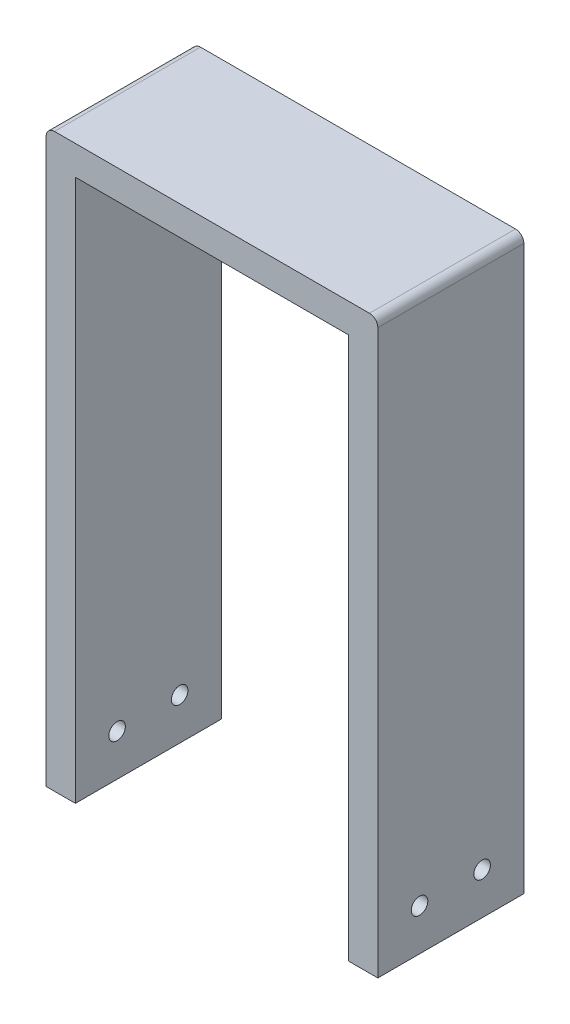
ISO-10303-21;
HEADER;
FILE_DESCRIPTION(('STEP AP214'),'2;1');
FILE_NAME('part.step','',(''),(''),'','','');
FILE_SCHEMA(('AUTOMOTIVE_DESIGN { 1 0 10303 214 1 1 1 1 }'));
ENDSEC;
DATA;
#1=APPLICATION_CONTEXT('core data for automotive mechanical design processes');
#2=APPLICATION_PROTOCOL_DEFINITION('international standard','automotive_design',2000,#1);
#3=PRODUCT_CONTEXT('',#1,'mechanical');
#4=PRODUCT('Part','Part','',(#3));
#5=PRODUCT_RELATED_PRODUCT_CATEGORY('part','',(#4));
#6=PRODUCT_DEFINITION_FORMATION('','',#4);
#7=PRODUCT_DEFINITION_CONTEXT('part definition',#1,'design');
#8=PRODUCT_DEFINITION('design','',#6,#7);
#9=PRODUCT_DEFINITION_SHAPE('','',#8);
#10=(LENGTH_UNIT() NAMED_UNIT(*) SI_UNIT(.MILLI.,.METRE.));
#11=(NAMED_UNIT(*) PLANE_ANGLE_UNIT() SI_UNIT($,.RADIAN.));
#12=(NAMED_UNIT(*) SI_UNIT($,.STERADIAN.) SOLID_ANGLE_UNIT());
#13=UNCERTAINTY_MEASURE_WITH_UNIT(LENGTH_MEASURE(1.E-05),#10,'distance_accuracy_value','');
#14=(GEOMETRIC_REPRESENTATION_CONTEXT(3) GLOBAL_UNCERTAINTY_ASSIGNED_CONTEXT((#13)) GLOBAL_UNIT_ASSIGNED_CONTEXT((#10,
#11,#12)) REPRESENTATION_CONTEXT('',''));
#15=CARTESIAN_POINT('',(0.,0.,0.));
#16=DIRECTION('',(0.,0.,1.));
#17=DIRECTION('',(1.,0.,0.));
#18=AXIS2_PLACEMENT_3D('',#15,#16,#17);
#19=CARTESIAN_POINT('',(-32.75,-65.,17.5));
#20=DIRECTION('',(-1.,0.,0.));
#21=DIRECTION('',(0.,0.,1.));
#22=AXIS2_PLACEMENT_3D('',#19,#20,#21);
#23=PLANE('',#22);
#24=CARTESIAN_POINT('',(-32.75,-55.,7.5));
#25=DIRECTION('',(-1.,0.,0.));
#26=DIRECTION('',(0.,0.,1.));
#27=AXIS2_PLACEMENT_3D('',#24,#25,#26);
#28=CIRCLE('',#27,1.98501);
#29=CARTESIAN_POINT('',(-32.75,-55.,9.48501));
#30=VERTEX_POINT('',#29);
#31=EDGE_CURVE('E242',#30,#30,#28,.T.);
#32=ORIENTED_EDGE('',*,*,#31,.T.);
#33=EDGE_LOOP('',(#32));
#34=FACE_BOUND('',#33,.T.);
#35=CARTESIAN_POINT('',(-32.75,-55.,-7.5));
#36=DIRECTION('',(-1.,0.,0.));
#37=DIRECTION('',(0.,0.,1.));
#38=AXIS2_PLACEMENT_3D('',#35,#36,#37);
#39=CIRCLE('',#38,1.98501);
#40=CARTESIAN_POINT('',(-32.75,-55.,-5.51499));
#41=VERTEX_POINT('',#40);
#42=EDGE_CURVE('E261',#41,#41,#39,.T.);
#43=ORIENTED_EDGE('',*,*,#42,.T.);
#44=EDGE_LOOP('',(#43));
#45=FACE_BOUND('',#44,.T.);
#46=DIRECTION('',(0.,1.,0.));
#47=VECTOR('',#46,1.);
#48=CARTESIAN_POINT('',(-32.75,-65.,-17.5));
#49=LINE('',#48,#47);
#50=CARTESIAN_POINT('',(-32.75,-65.,-17.5));
#51=VERTEX_POINT('',#50);
#52=CARTESIAN_POINT('',(-32.75,65.,-17.5));
#53=VERTEX_POINT('',#52);
#54=EDGE_CURVE('E150',#51,#53,#49,.T.);
#55=ORIENTED_EDGE('',*,*,#54,.T.);
#56=DIRECTION('',(0.,0.,-1.));
#57=VECTOR('',#56,1.);
#58=CARTESIAN_POINT('',(-32.75,65.,17.5));
#59=LINE('',#58,#57);
#60=CARTESIAN_POINT('',(-32.75,65.,17.5));
#61=VERTEX_POINT('',#60);
#62=EDGE_CURVE('E129',#61,#53,#59,.T.);
#63=ORIENTED_EDGE('',*,*,#62,.F.);
#64=DIRECTION('',(0.,1.,0.));
#65=VECTOR('',#64,1.);
#66=CARTESIAN_POINT('',(-32.75,-65.,17.5));
#67=LINE('',#66,#65);
#68=CARTESIAN_POINT('',(-32.75,-65.,17.5));
#69=VERTEX_POINT('',#68);
#70=EDGE_CURVE('E137',#69,#61,#67,.T.);
#71=ORIENTED_EDGE('',*,*,#70,.F.);
#72=DIRECTION('',(0.,0.,-1.));
#73=VECTOR('',#72,1.);
#74=CARTESIAN_POINT('',(-32.75,-65.,17.5));
#75=LINE('',#74,#73);
#76=EDGE_CURVE('E212',#69,#51,#75,.T.);
#77=ORIENTED_EDGE('',*,*,#76,.T.);
#78=EDGE_LOOP('',(#55,#63,#71,#77));
#79=FACE_BOUND('',#78,.T.);
#80=ADVANCED_FACE('F45',(#34,#45,#79),#23,.F.);
#81=CARTESIAN_POINT('',(32.75,65.,17.5));
#82=DIRECTION('',(0.,1.,0.));
#83=DIRECTION('',(-1.,0.,0.));
#84=AXIS2_PLACEMENT_3D('',#81,#82,#83);
#85=PLANE('',#84);
#86=DIRECTION('',(1.,0.,0.));
#87=VECTOR('',#86,1.);
#88=CARTESIAN_POINT('',(32.75,65.,-17.5));
#89=LINE('',#88,#87);
#90=CARTESIAN_POINT('',(32.75,65.,-17.5));
#91=VERTEX_POINT('',#90);
#92=EDGE_CURVE('E235',#53,#91,#89,.T.);
#93=ORIENTED_EDGE('',*,*,#92,.T.);
#94=DIRECTION('',(0.,0.,-1.));
#95=VECTOR('',#94,1.);
#96=CARTESIAN_POINT('',(32.75,65.,17.5));
#97=LINE('',#96,#95);
#98=CARTESIAN_POINT('',(32.75,65.,17.5));
#99=VERTEX_POINT('',#98);
#100=EDGE_CURVE('E132',#99,#91,#97,.T.);
#101=ORIENTED_EDGE('',*,*,#100,.F.);
#102=DIRECTION('',(1.,0.,0.));
#103=VECTOR('',#102,1.);
#104=CARTESIAN_POINT('',(32.75,65.,17.5));
#105=LINE('',#104,#103);
#106=EDGE_CURVE('E125',#61,#99,#105,.T.);
#107=ORIENTED_EDGE('',*,*,#106,.F.);
#108=ORIENTED_EDGE('',*,*,#62,.T.);
#109=EDGE_LOOP('',(#93,#101,#107,#108));
#110=FACE_BOUND('',#109,.T.);
#111=ADVANCED_FACE('F127',(#110),#85,.F.);
#112=CARTESIAN_POINT('',(32.75,-65.,17.5));
#113=DIRECTION('',(1.,0.,0.));
#114=DIRECTION('',(0.,0.,-1.));
#115=AXIS2_PLACEMENT_3D('',#112,#113,#114);
#116=PLANE('',#115);
#117=CARTESIAN_POINT('',(32.75,-55.,7.5));
#118=DIRECTION('',(1.,0.,0.));
#119=DIRECTION('',(0.,0.,-1.));
#120=AXIS2_PLACEMENT_3D('',#117,#118,#119);
#121=CIRCLE('',#120,1.98501);
#122=CARTESIAN_POINT('',(32.75,-55.,5.51499));
#123=VERTEX_POINT('',#122);
#124=EDGE_CURVE('E257',#123,#123,#121,.T.);
#125=ORIENTED_EDGE('',*,*,#124,.T.);
#126=EDGE_LOOP('',(#125));
#127=FACE_BOUND('',#126,.T.);
#128=CARTESIAN_POINT('',(32.75,-55.,-7.5));
#129=DIRECTION('',(1.,0.,0.));
#130=DIRECTION('',(0.,0.,-1.));
#131=AXIS2_PLACEMENT_3D('',#128,#129,#130);
#132=CIRCLE('',#131,1.98501);
#133=CARTESIAN_POINT('',(32.75,-55.,-9.48501));
#134=VERTEX_POINT('',#133);
#135=EDGE_CURVE('E265',#134,#134,#132,.T.);
#136=ORIENTED_EDGE('',*,*,#135,.T.);
#137=EDGE_LOOP('',(#136));
#138=FACE_BOUND('',#137,.T.);
#139=DIRECTION('',(0.,-1.,0.));
#140=VECTOR('',#139,1.);
#141=CARTESIAN_POINT('',(32.75,-65.,-17.5));
#142=LINE('',#141,#140);
#143=CARTESIAN_POINT('',(32.75,-65.,-17.5));
#144=VERTEX_POINT('',#143);
#145=EDGE_CURVE('E232',#91,#144,#142,.T.);
#146=ORIENTED_EDGE('',*,*,#145,.T.);
#147=DIRECTION('',(0.,0.,-1.));
#148=VECTOR('',#147,1.);
#149=CARTESIAN_POINT('',(32.75,-65.,17.5));
#150=LINE('',#149,#148);
#151=CARTESIAN_POINT('',(32.75,-65.,17.5));
#152=VERTEX_POINT('',#151);
#153=EDGE_CURVE('E159',#152,#144,#150,.T.);
#154=ORIENTED_EDGE('',*,*,#153,.F.);
#155=DIRECTION('',(0.,-1.,0.));
#156=VECTOR('',#155,1.);
#157=CARTESIAN_POINT('',(32.75,-65.,17.5));
#158=LINE('',#157,#156);
#159=EDGE_CURVE('E136',#99,#152,#158,.T.);
#160=ORIENTED_EDGE('',*,*,#159,.F.);
#161=ORIENTED_EDGE('',*,*,#100,.T.);
#162=EDGE_LOOP('',(#146,#154,#160,#161));
#163=FACE_BOUND('',#162,.T.);
#164=ADVANCED_FACE('F296',(#127,#138,#163),#116,.F.);
#165=CARTESIAN_POINT('',(32.75,-65.,17.5));
#166=DIRECTION('',(0.,1.,0.));
#167=DIRECTION('',(0.,0.,1.));
#168=AXIS2_PLACEMENT_3D('',#165,#166,#167);
#169=PLANE('',#168);
#170=DIRECTION('',(1.,0.,0.));
#171=VECTOR('',#170,1.);
#172=CARTESIAN_POINT('',(32.75,-65.,-17.5));
#173=LINE('',#172,#171);
#174=CARTESIAN_POINT('',(39.75,-65.,-17.5));
#175=VERTEX_POINT('',#174);
#176=EDGE_CURVE('E206',#144,#175,#173,.T.);
#177=ORIENTED_EDGE('',*,*,#176,.T.);
#178=DIRECTION('',(0.,0.,-1.));
#179=VECTOR('',#178,1.);
#180=CARTESIAN_POINT('',(39.75,-65.,17.5));
#181=LINE('',#180,#179);
#182=CARTESIAN_POINT('',(39.75,-65.,17.5));
#183=VERTEX_POINT('',#182);
#184=EDGE_CURVE('E217',#183,#175,#181,.T.);
#185=ORIENTED_EDGE('',*,*,#184,.F.);
#186=DIRECTION('',(1.,0.,0.));
#187=VECTOR('',#186,1.);
#188=CARTESIAN_POINT('',(32.75,-65.,17.5));
#189=LINE('',#188,#187);
#190=EDGE_CURVE('E228',#152,#183,#189,.T.);
#191=ORIENTED_EDGE('',*,*,#190,.F.);
#192=ORIENTED_EDGE('',*,*,#153,.T.);
#193=EDGE_LOOP('',(#177,#185,#191,#192));
#194=FACE_BOUND('',#193,.T.);
#195=ADVANCED_FACE('F226',(#194),#169,.F.);
#196=CARTESIAN_POINT('',(39.75,-65.,17.5));
#197=DIRECTION('',(-1.,0.,0.));
#198=DIRECTION('',(0.,0.,1.));
#199=AXIS2_PLACEMENT_3D('',#196,#197,#198);
#200=PLANE('',#199);
#201=CARTESIAN_POINT('',(39.75,-55.,7.5));
#202=DIRECTION('',(1.,0.,0.));
#203=DIRECTION('',(0.,0.,-1.));
#204=AXIS2_PLACEMENT_3D('',#201,#202,#203);
#205=CIRCLE('',#204,1.98501);
#206=CARTESIAN_POINT('',(39.75,-55.,5.51499));
#207=VERTEX_POINT('',#206);
#208=EDGE_CURVE('E274',#207,#207,#205,.T.);
#209=ORIENTED_EDGE('',*,*,#208,.F.);
#210=EDGE_LOOP('',(#209));
#211=FACE_BOUND('',#210,.T.);
#212=CARTESIAN_POINT('',(39.75,-55.,-7.5));
#213=DIRECTION('',(1.,0.,0.));
#214=DIRECTION('',(0.,0.,-1.));
#215=AXIS2_PLACEMENT_3D('',#212,#213,#214);
#216=CIRCLE('',#215,1.98501);
#217=CARTESIAN_POINT('',(39.75,-55.,-9.48501));
#218=VERTEX_POINT('',#217);
#219=EDGE_CURVE('E270',#218,#218,#216,.T.);
#220=ORIENTED_EDGE('',*,*,#219,.F.);
#221=EDGE_LOOP('',(#220));
#222=FACE_BOUND('',#221,.T.);
#223=DIRECTION('',(0.,1.,0.));
#224=VECTOR('',#223,1.);
#225=CARTESIAN_POINT('',(39.75,-65.,-17.5));
#226=LINE('',#225,#224);
#227=CARTESIAN_POINT('',(39.75,70.,-17.5));
#228=VERTEX_POINT('',#227);
#229=EDGE_CURVE('E201',#175,#228,#226,.T.);
#230=ORIENTED_EDGE('',*,*,#229,.T.);
#231=DIRECTION('',(0.,0.,-1.));
#232=VECTOR('',#231,1.);
#233=CARTESIAN_POINT('',(39.75,70.,17.5));
#234=LINE('',#233,#232);
#235=CARTESIAN_POINT('',(39.75,70.,17.5));
#236=VERTEX_POINT('',#235);
#237=EDGE_CURVE('E11',#228,#236,#234,.F.);
#238=ORIENTED_EDGE('',*,*,#237,.T.);
#239=DIRECTION('',(0.,1.,0.));
#240=VECTOR('',#239,1.);
#241=CARTESIAN_POINT('',(39.75,-65.,17.5));
#242=LINE('',#241,#240);
#243=EDGE_CURVE('E247',#183,#236,#242,.T.);
#244=ORIENTED_EDGE('',*,*,#243,.F.);
#245=ORIENTED_EDGE('',*,*,#184,.T.);
#246=EDGE_LOOP('',(#230,#238,#244,#245));
#247=FACE_BOUND('',#246,.T.);
#248=ADVANCED_FACE('F289',(#211,#222,#247),#200,.F.);
#249=CARTESIAN_POINT('',(39.75,72.,17.5));
#250=DIRECTION('',(0.,-1.,0.));
#251=DIRECTION('',(1.,0.,0.));
#252=AXIS2_PLACEMENT_3D('',#249,#250,#251);
#253=PLANE('',#252);
#254=DIRECTION('',(-1.,0.,0.));
#255=VECTOR('',#254,1.);
#256=CARTESIAN_POINT('',(39.75,72.,-17.5));
#257=LINE('',#256,#255);
#258=CARTESIAN_POINT('',(37.75,72.,-17.5));
#259=VERTEX_POINT('',#258);
#260=CARTESIAN_POINT('',(-37.75,72.,-17.5));
#261=VERTEX_POINT('',#260);
#262=EDGE_CURVE('E195',#259,#261,#257,.T.);
#263=ORIENTED_EDGE('',*,*,#262,.T.);
#264=DIRECTION('',(0.,0.,-1.));
#265=VECTOR('',#264,1.);
#266=CARTESIAN_POINT('',(-37.75,72.,17.5));
#267=LINE('',#266,#265);
#268=CARTESIAN_POINT('',(-37.75,72.,17.5));
#269=VERTEX_POINT('',#268);
#270=EDGE_CURVE('E67',#261,#269,#267,.F.);
#271=ORIENTED_EDGE('',*,*,#270,.T.);
#272=DIRECTION('',(-1.,0.,0.));
#273=VECTOR('',#272,1.);
#274=CARTESIAN_POINT('',(39.75,72.,17.5));
#275=LINE('',#274,#273);
#276=CARTESIAN_POINT('',(37.75,72.,17.5));
#277=VERTEX_POINT('',#276);
#278=EDGE_CURVE('E181',#277,#269,#275,.T.);
#279=ORIENTED_EDGE('',*,*,#278,.F.);
#280=DIRECTION('',(0.,0.,-1.));
#281=VECTOR('',#280,1.);
#282=CARTESIAN_POINT('',(37.75,72.,17.5));
#283=LINE('',#282,#281);
#284=EDGE_CURVE('E168',#277,#259,#283,.T.);
#285=ORIENTED_EDGE('',*,*,#284,.T.);
#286=EDGE_LOOP('',(#263,#271,#279,#285));
#287=FACE_BOUND('',#286,.T.);
#288=ADVANCED_FACE('F198',(#287),#253,.F.);
#289=CARTESIAN_POINT('',(-39.75,-65.,17.5));
#290=DIRECTION('',(1.,0.,0.));
#291=DIRECTION('',(0.,1.,0.));
#292=AXIS2_PLACEMENT_3D('',#289,#290,#291);
#293=PLANE('',#292);
#294=CARTESIAN_POINT('',(-39.75,-55.,7.5));
#295=DIRECTION('',(1.,0.,0.));
#296=DIRECTION('',(0.,0.,-1.));
#297=AXIS2_PLACEMENT_3D('',#294,#295,#296);
#298=CIRCLE('',#297,1.98501);
#299=CARTESIAN_POINT('',(-39.75,-55.,5.51499));
#300=VERTEX_POINT('',#299);
#301=EDGE_CURVE('E269',#300,#300,#298,.T.);
#302=ORIENTED_EDGE('',*,*,#301,.T.);
#303=EDGE_LOOP('',(#302));
#304=FACE_BOUND('',#303,.T.);
#305=CARTESIAN_POINT('',(-39.75,-55.,-7.5));
#306=DIRECTION('',(1.,0.,0.));
#307=DIRECTION('',(0.,0.,-1.));
#308=AXIS2_PLACEMENT_3D('',#305,#306,#307);
#309=CIRCLE('',#308,1.98501);
#310=CARTESIAN_POINT('',(-39.75,-55.,-9.48501));
#311=VERTEX_POINT('',#310);
#312=EDGE_CURVE('E275',#311,#311,#309,.T.);
#313=ORIENTED_EDGE('',*,*,#312,.T.);
#314=EDGE_LOOP('',(#313));
#315=FACE_BOUND('',#314,.T.);
#316=DIRECTION('',(0.,-1.,0.));
#317=VECTOR('',#316,1.);
#318=CARTESIAN_POINT('',(-39.75,-65.,17.5));
#319=LINE('',#318,#317);
#320=CARTESIAN_POINT('',(-39.75,70.,17.5));
#321=VERTEX_POINT('',#320);
#322=CARTESIAN_POINT('',(-39.75,-65.,17.5));
#323=VERTEX_POINT('',#322);
#324=EDGE_CURVE('E179',#321,#323,#319,.T.);
#325=ORIENTED_EDGE('',*,*,#324,.F.);
#326=DIRECTION('',(0.,0.,-1.));
#327=VECTOR('',#326,1.);
#328=CARTESIAN_POINT('',(-39.75,70.,17.5));
#329=LINE('',#328,#327);
#330=CARTESIAN_POINT('',(-39.75,70.,-17.5));
#331=VERTEX_POINT('',#330);
#332=EDGE_CURVE('E152',#321,#331,#329,.T.);
#333=ORIENTED_EDGE('',*,*,#332,.T.);
#334=DIRECTION('',(0.,-1.,0.));
#335=VECTOR('',#334,1.);
#336=CARTESIAN_POINT('',(-39.75,-65.,-17.5));
#337=LINE('',#336,#335);
#338=CARTESIAN_POINT('',(-39.75,-65.,-17.5));
#339=VERTEX_POINT('',#338);
#340=EDGE_CURVE('E197',#331,#339,#337,.T.);
#341=ORIENTED_EDGE('',*,*,#340,.T.);
#342=DIRECTION('',(0.,0.,-1.));
#343=VECTOR('',#342,1.);
#344=CARTESIAN_POINT('',(-39.75,-65.,17.5));
#345=LINE('',#344,#343);
#346=EDGE_CURVE('E188',#323,#339,#345,.T.);
#347=ORIENTED_EDGE('',*,*,#346,.F.);
#348=EDGE_LOOP('',(#325,#333,#341,#347));
#349=FACE_BOUND('',#348,.T.);
#350=ADVANCED_FACE('F185',(#304,#315,#349),#293,.F.);
#351=CARTESIAN_POINT('',(-39.75,-65.,17.5));
#352=DIRECTION('',(0.,1.,0.));
#353=DIRECTION('',(0.,0.,1.));
#354=AXIS2_PLACEMENT_3D('',#351,#352,#353);
#355=PLANE('',#354);
#356=DIRECTION('',(1.,0.,0.));
#357=VECTOR('',#356,1.);
#358=CARTESIAN_POINT('',(-39.75,-65.,-17.5));
#359=LINE('',#358,#357);
#360=EDGE_CURVE('E147',#339,#51,#359,.T.);
#361=ORIENTED_EDGE('',*,*,#360,.T.);
#362=ORIENTED_EDGE('',*,*,#76,.F.);
#363=DIRECTION('',(1.,0.,0.));
#364=VECTOR('',#363,1.);
#365=CARTESIAN_POINT('',(-39.75,-65.,17.5));
#366=LINE('',#365,#364);
#367=EDGE_CURVE('E142',#323,#69,#366,.T.);
#368=ORIENTED_EDGE('',*,*,#367,.F.);
#369=ORIENTED_EDGE('',*,*,#346,.T.);
#370=EDGE_LOOP('',(#361,#362,#368,#369));
#371=FACE_BOUND('',#370,.T.);
#372=ADVANCED_FACE('F341',(#371),#355,.F.);
#373=CARTESIAN_POINT('',(0.,0.,17.5));
#374=DIRECTION('',(0.,0.,1.));
#375=DIRECTION('',(1.,0.,0.));
#376=AXIS2_PLACEMENT_3D('',#373,#374,#375);
#377=PLANE('',#376);
#378=ORIENTED_EDGE('',*,*,#278,.T.);
#379=CARTESIAN_POINT('',(-37.75,70.,17.5));
#380=DIRECTION('',(0.,0.,1.));
#381=DIRECTION('',(1.,0.,0.));
#382=AXIS2_PLACEMENT_3D('',#379,#380,#381);
#383=CIRCLE('',#382,2.);
#384=EDGE_CURVE('E54',#269,#321,#383,.T.);
#385=ORIENTED_EDGE('',*,*,#384,.T.);
#386=ORIENTED_EDGE('',*,*,#324,.T.);
#387=ORIENTED_EDGE('',*,*,#367,.T.);
#388=ORIENTED_EDGE('',*,*,#70,.T.);
#389=ORIENTED_EDGE('',*,*,#106,.T.);
#390=ORIENTED_EDGE('',*,*,#159,.T.);
#391=ORIENTED_EDGE('',*,*,#190,.T.);
#392=ORIENTED_EDGE('',*,*,#243,.T.);
#393=CARTESIAN_POINT('',(37.75,70.,17.5));
#394=DIRECTION('',(0.,0.,1.));
#395=DIRECTION('',(1.,0.,0.));
#396=AXIS2_PLACEMENT_3D('',#393,#394,#395);
#397=CIRCLE('',#396,2.);
#398=EDGE_CURVE('E174',#236,#277,#397,.T.);
#399=ORIENTED_EDGE('',*,*,#398,.T.);
#400=EDGE_LOOP('',(#378,#385,#386,#387,#388,#389,#390,#391,#392,#399));
#401=FACE_BOUND('',#400,.T.);
#402=ADVANCED_FACE('F140',(#401),#377,.T.);
#403=CARTESIAN_POINT('',(0.,0.,-17.5));
#404=DIRECTION('',(0.,0.,1.));
#405=DIRECTION('',(1.,0.,0.));
#406=AXIS2_PLACEMENT_3D('',#403,#404,#405);
#407=PLANE('',#406);
#408=ORIENTED_EDGE('',*,*,#340,.F.);
#409=CARTESIAN_POINT('',(-37.75,70.,-17.5));
#410=DIRECTION('',(0.,0.,1.));
#411=DIRECTION('',(1.,0.,0.));
#412=AXIS2_PLACEMENT_3D('',#409,#410,#411);
#413=CIRCLE('',#412,2.);
#414=EDGE_CURVE('E165',#331,#261,#413,.F.);
#415=ORIENTED_EDGE('',*,*,#414,.T.);
#416=ORIENTED_EDGE('',*,*,#262,.F.);
#417=CARTESIAN_POINT('',(37.75,70.,-17.5));
#418=DIRECTION('',(0.,0.,1.));
#419=DIRECTION('',(1.,0.,0.));
#420=AXIS2_PLACEMENT_3D('',#417,#418,#419);
#421=CIRCLE('',#420,2.);
#422=EDGE_CURVE('E157',#259,#228,#421,.F.);
#423=ORIENTED_EDGE('',*,*,#422,.T.);
#424=ORIENTED_EDGE('',*,*,#229,.F.);
#425=ORIENTED_EDGE('',*,*,#176,.F.);
#426=ORIENTED_EDGE('',*,*,#145,.F.);
#427=ORIENTED_EDGE('',*,*,#92,.F.);
#428=ORIENTED_EDGE('',*,*,#54,.F.);
#429=ORIENTED_EDGE('',*,*,#360,.F.);
#430=EDGE_LOOP('',(#408,#415,#416,#423,#424,#425,#426,#427,#428,#429));
#431=FACE_BOUND('',#430,.T.);
#432=ADVANCED_FACE('F194',(#431),#407,.F.);
#433=CARTESIAN_POINT('',(-39.75,-55.,-7.5));
#434=DIRECTION('',(1.,0.,0.));
#435=DIRECTION('',(0.,0.,-1.));
#436=AXIS2_PLACEMENT_3D('',#433,#434,#435);
#437=CYLINDRICAL_SURFACE('',#436,1.98501);
#438=ORIENTED_EDGE('',*,*,#312,.F.);
#439=EDGE_LOOP('',(#438));
#440=FACE_BOUND('',#439,.T.);
#441=ORIENTED_EDGE('',*,*,#42,.F.);
#442=EDGE_LOOP('',(#441));
#443=FACE_BOUND('',#442,.T.);
#444=ADVANCED_FACE('F329',(#440,#443),#437,.F.);
#445=CARTESIAN_POINT('',(-39.75,-55.,7.5));
#446=DIRECTION('',(1.,0.,0.));
#447=DIRECTION('',(0.,0.,-1.));
#448=AXIS2_PLACEMENT_3D('',#445,#446,#447);
#449=CYLINDRICAL_SURFACE('',#448,1.98501);
#450=ORIENTED_EDGE('',*,*,#301,.F.);
#451=EDGE_LOOP('',(#450));
#452=FACE_BOUND('',#451,.T.);
#453=ORIENTED_EDGE('',*,*,#31,.F.);
#454=EDGE_LOOP('',(#453));
#455=FACE_BOUND('',#454,.T.);
#456=ADVANCED_FACE('F323',(#452,#455),#449,.F.);
#457=ORIENTED_EDGE('',*,*,#219,.T.);
#458=EDGE_LOOP('',(#457));
#459=FACE_BOUND('',#458,.T.);
#460=ORIENTED_EDGE('',*,*,#135,.F.);
#461=EDGE_LOOP('',(#460));
#462=FACE_BOUND('',#461,.T.);
#463=ADVANCED_FACE('F321',(#459,#462),#437,.F.);
#464=ORIENTED_EDGE('',*,*,#208,.T.);
#465=EDGE_LOOP('',(#464));
#466=FACE_BOUND('',#465,.T.);
#467=ORIENTED_EDGE('',*,*,#124,.F.);
#468=EDGE_LOOP('',(#467));
#469=FACE_BOUND('',#468,.T.);
#470=ADVANCED_FACE('F286',(#466,#469),#449,.F.);
#471=CARTESIAN_POINT('',(-37.75,70.,17.5));
#472=DIRECTION('',(0.,0.,-1.));
#473=DIRECTION('',(-1.,0.,0.));
#474=AXIS2_PLACEMENT_3D('',#471,#472,#473);
#475=CYLINDRICAL_SURFACE('',#474,2.);
#476=ORIENTED_EDGE('',*,*,#384,.F.);
#477=ORIENTED_EDGE('',*,*,#270,.F.);
#478=ORIENTED_EDGE('',*,*,#414,.F.);
#479=ORIENTED_EDGE('',*,*,#332,.F.);
#480=EDGE_LOOP('',(#476,#477,#478,#479));
#481=FACE_BOUND('',#480,.T.);
#482=ADVANCED_FACE('F191',(#481),#475,.T.);
#483=CARTESIAN_POINT('',(37.75,70.,17.5));
#484=DIRECTION('',(0.,0.,-1.));
#485=DIRECTION('',(-1.,0.,0.));
#486=AXIS2_PLACEMENT_3D('',#483,#484,#485);
#487=CYLINDRICAL_SURFACE('',#486,2.);
#488=ORIENTED_EDGE('',*,*,#398,.F.);
#489=ORIENTED_EDGE('',*,*,#237,.F.);
#490=ORIENTED_EDGE('',*,*,#422,.F.);
#491=ORIENTED_EDGE('',*,*,#284,.F.);
#492=EDGE_LOOP('',(#488,#489,#490,#491));
#493=FACE_BOUND('',#492,.T.);
#494=ADVANCED_FACE('F47',(#493),#487,.T.);
#495=CLOSED_SHELL('',(#80,#111,#164,#195,#248,#288,#350,#372,#402,#432,#444,#456,#463,#470,#482,#494));
#496=MANIFOLD_SOLID_BREP('B2',#495);
#497=ADVANCED_BREP_SHAPE_REPRESENTATION('',(#18,#496),#14);
#498=SHAPE_DEFINITION_REPRESENTATION(#9,#497);
ENDSEC;
END-ISO-10303-21;
